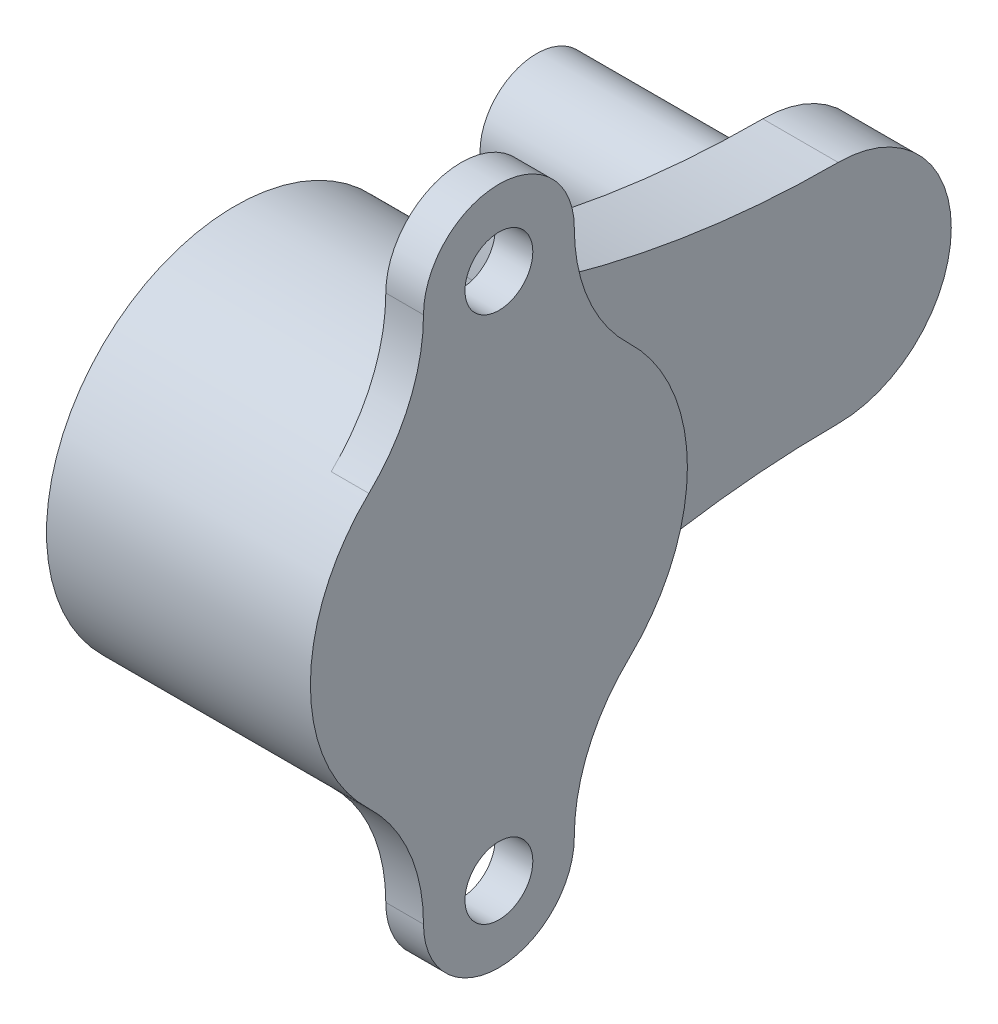
ISO-10303-21;
HEADER;
FILE_DESCRIPTION(('STEP AP214'),'2;1');
FILE_NAME('part.step','',(''),(''),'','','');
FILE_SCHEMA(('AUTOMOTIVE_DESIGN { 1 0 10303 214 1 1 1 1 }'));
ENDSEC;
DATA;
#1=APPLICATION_CONTEXT('core data for automotive mechanical design processes');
#2=APPLICATION_PROTOCOL_DEFINITION('international standard','automotive_design',2000,#1);
#3=PRODUCT_CONTEXT('',#1,'mechanical');
#4=PRODUCT('Part','Part','',(#3));
#5=PRODUCT_RELATED_PRODUCT_CATEGORY('part','',(#4));
#6=PRODUCT_DEFINITION_FORMATION('','',#4);
#7=PRODUCT_DEFINITION_CONTEXT('part definition',#1,'design');
#8=PRODUCT_DEFINITION('design','',#6,#7);
#9=PRODUCT_DEFINITION_SHAPE('','',#8);
#10=(LENGTH_UNIT() NAMED_UNIT(*) SI_UNIT(.MILLI.,.METRE.));
#11=(NAMED_UNIT(*) PLANE_ANGLE_UNIT() SI_UNIT($,.RADIAN.));
#12=(NAMED_UNIT(*) SI_UNIT($,.STERADIAN.) SOLID_ANGLE_UNIT());
#13=UNCERTAINTY_MEASURE_WITH_UNIT(LENGTH_MEASURE(1.E-05),#10,'distance_accuracy_value','');
#14=(GEOMETRIC_REPRESENTATION_CONTEXT(3) GLOBAL_UNCERTAINTY_ASSIGNED_CONTEXT((#13)) GLOBAL_UNIT_ASSIGNED_CONTEXT((#10,
#11,#12)) REPRESENTATION_CONTEXT('',''));
#15=CARTESIAN_POINT('',(0.,0.,0.));
#16=DIRECTION('',(0.,0.,1.));
#17=DIRECTION('',(1.,0.,0.));
#18=AXIS2_PLACEMENT_3D('',#15,#16,#17);
#19=CARTESIAN_POINT('',(0.,0.,0.));
#20=DIRECTION('',(1.,0.,0.));
#21=DIRECTION('',(0.,0.,-1.));
#22=AXIS2_PLACEMENT_3D('',#19,#20,#21);
#23=CYLINDRICAL_SURFACE('',#22,25.);
#24=CARTESIAN_POINT('',(-15.,0.,0.));
#25=DIRECTION('',(1.,0.,0.));
#26=DIRECTION('',(0.,0.,-1.));
#27=AXIS2_PLACEMENT_3D('',#24,#25,#26);
#28=CIRCLE('',#27,25.);
#29=CARTESIAN_POINT('',(-15.,0.,-25.));
#30=VERTEX_POINT('',#29);
#31=EDGE_CURVE('E238',#30,#30,#28,.T.);
#32=ORIENTED_EDGE('',*,*,#31,.T.);
#33=EDGE_LOOP('',(#32));
#34=FACE_BOUND('',#33,.T.);
#35=CARTESIAN_POINT('',(15.,0.,0.));
#36=DIRECTION('',(1.,0.,0.));
#37=DIRECTION('',(0.,0.,-1.));
#38=AXIS2_PLACEMENT_3D('',#35,#36,#37);
#39=CIRCLE('',#38,25.);
#40=CARTESIAN_POINT('',(15.,18.1034482758621,-17.2413793103448));
#41=VERTEX_POINT('',#40);
#42=CARTESIAN_POINT('',(15.,18.1034482758621,17.2413793103448));
#43=VERTEX_POINT('',#42);
#44=EDGE_CURVE('E242',#41,#43,#39,.T.);
#45=ORIENTED_EDGE('',*,*,#44,.F.);
#46=DIRECTION('',(-1.,0.,0.));
#47=VECTOR('',#46,1.);
#48=CARTESIAN_POINT('',(20.,18.1034482758621,-17.2413793103448));
#49=LINE('',#48,#47);
#50=CARTESIAN_POINT('',(20.,18.1034482758621,-17.2413793103448));
#51=VERTEX_POINT('',#50);
#52=EDGE_CURVE('E205',#51,#41,#49,.T.);
#53=ORIENTED_EDGE('',*,*,#52,.F.);
#54=CARTESIAN_POINT('',(20.,0.,0.));
#55=DIRECTION('',(1.,0.,0.));
#56=DIRECTION('',(0.,0.,-1.));
#57=AXIS2_PLACEMENT_3D('',#54,#55,#56);
#58=CIRCLE('',#57,25.);
#59=CARTESIAN_POINT('',(20.,-18.1034482758621,-17.2413793103448));
#60=VERTEX_POINT('',#59);
#61=EDGE_CURVE('E181',#60,#51,#58,.T.);
#62=ORIENTED_EDGE('',*,*,#61,.F.);
#63=DIRECTION('',(-1.,0.,0.));
#64=VECTOR('',#63,1.);
#65=CARTESIAN_POINT('',(20.,-18.1034482758621,-17.2413793103448));
#66=LINE('',#65,#64);
#67=CARTESIAN_POINT('',(15.,-18.1034482758621,-17.2413793103448));
#68=VERTEX_POINT('',#67);
#69=EDGE_CURVE('E208',#60,#68,#66,.T.);
#70=ORIENTED_EDGE('',*,*,#69,.T.);
#71=CARTESIAN_POINT('',(15.,-18.1034482758621,17.2413793103448));
#72=VERTEX_POINT('',#71);
#73=EDGE_CURVE('E241',#72,#68,#39,.T.);
#74=ORIENTED_EDGE('',*,*,#73,.F.);
#75=DIRECTION('',(-1.,0.,0.));
#76=VECTOR('',#75,1.);
#77=CARTESIAN_POINT('',(20.,-18.1034482758621,17.2413793103448));
#78=LINE('',#77,#76);
#79=CARTESIAN_POINT('',(20.,-18.1034482758621,17.2413793103448));
#80=VERTEX_POINT('',#79);
#81=EDGE_CURVE('E217',#80,#72,#78,.T.);
#82=ORIENTED_EDGE('',*,*,#81,.F.);
#83=CARTESIAN_POINT('',(20.,0.,0.));
#84=DIRECTION('',(1.,0.,0.));
#85=DIRECTION('',(0.,0.,-1.));
#86=AXIS2_PLACEMENT_3D('',#83,#84,#85);
#87=CIRCLE('',#86,25.);
#88=CARTESIAN_POINT('',(20.,18.1034482758621,17.2413793103448));
#89=VERTEX_POINT('',#88);
#90=EDGE_CURVE('E172',#89,#80,#87,.T.);
#91=ORIENTED_EDGE('',*,*,#90,.F.);
#92=DIRECTION('',(-1.,0.,0.));
#93=VECTOR('',#92,1.);
#94=CARTESIAN_POINT('',(20.,18.1034482758621,17.2413793103448));
#95=LINE('',#94,#93);
#96=EDGE_CURVE('E220',#89,#43,#95,.T.);
#97=ORIENTED_EDGE('',*,*,#96,.T.);
#98=EDGE_LOOP('',(#45,#53,#62,#70,#74,#82,#91,#97));
#99=FACE_BOUND('',#98,.T.);
#100=DIRECTION('',(-1.,0.,0.));
#101=VECTOR('',#100,1.);
#102=CARTESIAN_POINT('',(10.,-23.4,-8.79999999999999));
#103=LINE('',#102,#101);
#104=CARTESIAN_POINT('',(10.,-23.4,-8.8));
#105=VERTEX_POINT('',#104);
#106=CARTESIAN_POINT('',(0.,-23.4,-8.79999999999998));
#107=VERTEX_POINT('',#106);
#108=EDGE_CURVE('E55',#105,#107,#103,.T.);
#109=ORIENTED_EDGE('',*,*,#108,.F.);
#110=CARTESIAN_POINT('',(10.,0.,0.));
#111=DIRECTION('',(-1.,0.,0.));
#112=DIRECTION('',(0.,0.,1.));
#113=AXIS2_PLACEMENT_3D('',#110,#111,#112);
#114=CIRCLE('',#113,25.);
#115=CARTESIAN_POINT('',(10.,23.4,-8.79999999999999));
#116=VERTEX_POINT('',#115);
#117=EDGE_CURVE('E11',#105,#116,#114,.F.);
#118=ORIENTED_EDGE('',*,*,#117,.T.);
#119=DIRECTION('',(-1.,0.,0.));
#120=VECTOR('',#119,1.);
#121=CARTESIAN_POINT('',(10.,23.4,-8.79999999999999));
#122=LINE('',#121,#120);
#123=CARTESIAN_POINT('',(0.,23.4,-8.79999999999999));
#124=VERTEX_POINT('',#123);
#125=EDGE_CURVE('E154',#116,#124,#122,.T.);
#126=ORIENTED_EDGE('',*,*,#125,.T.);
#127=CARTESIAN_POINT('',(0.,0.,0.));
#128=DIRECTION('',(-1.,0.,0.));
#129=DIRECTION('',(0.,0.,1.));
#130=AXIS2_PLACEMENT_3D('',#127,#128,#129);
#131=CIRCLE('',#130,25.);
#132=EDGE_CURVE('E45',#107,#124,#131,.F.);
#133=ORIENTED_EDGE('',*,*,#132,.F.);
#134=EDGE_LOOP('',(#109,#118,#126,#133));
#135=FACE_BOUND('',#134,.T.);
#136=ADVANCED_FACE('F37',(#34,#99,#135),#23,.T.);
#137=CARTESIAN_POINT('',(-15.,25.,0.));
#138=DIRECTION('',(-1.,0.,0.));
#139=DIRECTION('',(0.,0.,1.));
#140=AXIS2_PLACEMENT_3D('',#137,#138,#139);
#141=PLANE('',#140);
#142=CARTESIAN_POINT('',(-15.,0.,0.));
#143=DIRECTION('',(1.,0.,0.));
#144=DIRECTION('',(0.,0.,-1.));
#145=AXIS2_PLACEMENT_3D('',#142,#143,#144);
#146=CIRCLE('',#145,22.5);
#147=CARTESIAN_POINT('',(-15.,0.,-22.5));
#148=VERTEX_POINT('',#147);
#149=EDGE_CURVE('E235',#148,#148,#146,.T.);
#150=ORIENTED_EDGE('',*,*,#149,.T.);
#151=EDGE_LOOP('',(#150));
#152=FACE_BOUND('',#151,.T.);
#153=ORIENTED_EDGE('',*,*,#31,.F.);
#154=EDGE_LOOP('',(#153));
#155=FACE_BOUND('',#154,.T.);
#156=ADVANCED_FACE('F279',(#152,#155),#141,.T.);
#157=CARTESIAN_POINT('',(0.,0.,0.));
#158=DIRECTION('',(1.,0.,0.));
#159=DIRECTION('',(0.,0.,-1.));
#160=AXIS2_PLACEMENT_3D('',#157,#158,#159);
#161=CYLINDRICAL_SURFACE('',#160,22.5);
#162=CARTESIAN_POINT('',(-12.5,0.,0.));
#163=DIRECTION('',(1.,0.,0.));
#164=DIRECTION('',(0.,0.,-1.));
#165=AXIS2_PLACEMENT_3D('',#162,#163,#164);
#166=CIRCLE('',#165,22.5);
#167=CARTESIAN_POINT('',(-12.5,0.,-22.5));
#168=VERTEX_POINT('',#167);
#169=EDGE_CURVE('E232',#168,#168,#166,.T.);
#170=ORIENTED_EDGE('',*,*,#169,.T.);
#171=EDGE_LOOP('',(#170));
#172=FACE_BOUND('',#171,.T.);
#173=ORIENTED_EDGE('',*,*,#149,.F.);
#174=EDGE_LOOP('',(#173));
#175=FACE_BOUND('',#174,.T.);
#176=ADVANCED_FACE('F284',(#172,#175),#161,.F.);
#177=CARTESIAN_POINT('',(-12.5,7.5,0.));
#178=DIRECTION('',(-1.,0.,0.));
#179=DIRECTION('',(0.,0.,1.));
#180=AXIS2_PLACEMENT_3D('',#177,#178,#179);
#181=PLANE('',#180);
#182=CARTESIAN_POINT('',(-12.5,0.,0.));
#183=DIRECTION('',(1.,0.,0.));
#184=DIRECTION('',(0.,0.,-1.));
#185=AXIS2_PLACEMENT_3D('',#182,#183,#184);
#186=CIRCLE('',#185,7.5);
#187=CARTESIAN_POINT('',(-12.5,0.,-7.5));
#188=VERTEX_POINT('',#187);
#189=EDGE_CURVE('E229',#188,#188,#186,.T.);
#190=ORIENTED_EDGE('',*,*,#189,.T.);
#191=EDGE_LOOP('',(#190));
#192=FACE_BOUND('',#191,.T.);
#193=ORIENTED_EDGE('',*,*,#169,.F.);
#194=EDGE_LOOP('',(#193));
#195=FACE_BOUND('',#194,.T.);
#196=ADVANCED_FACE('F291',(#192,#195),#181,.T.);
#197=CARTESIAN_POINT('',(0.,0.,0.));
#198=DIRECTION('',(1.,0.,0.));
#199=DIRECTION('',(0.,0.,-1.));
#200=AXIS2_PLACEMENT_3D('',#197,#198,#199);
#201=CYLINDRICAL_SURFACE('',#200,7.5);
#202=CARTESIAN_POINT('',(-14.,0.,0.));
#203=DIRECTION('',(-1.,0.,0.));
#204=DIRECTION('',(0.,0.,1.));
#205=AXIS2_PLACEMENT_3D('',#202,#203,#204);
#206=CIRCLE('',#205,7.5);
#207=CARTESIAN_POINT('',(-14.,0.,7.5));
#208=VERTEX_POINT('',#207);
#209=EDGE_CURVE('E244',#208,#208,#206,.F.);
#210=ORIENTED_EDGE('',*,*,#209,.T.);
#211=EDGE_LOOP('',(#210));
#212=FACE_BOUND('',#211,.T.);
#213=ORIENTED_EDGE('',*,*,#189,.F.);
#214=EDGE_LOOP('',(#213));
#215=FACE_BOUND('',#214,.T.);
#216=ADVANCED_FACE('F295',(#212,#215),#201,.T.);
#217=CARTESIAN_POINT('',(-15.,7.5,0.));
#218=DIRECTION('',(-1.,0.,0.));
#219=DIRECTION('',(0.,0.,1.));
#220=AXIS2_PLACEMENT_3D('',#217,#218,#219);
#221=PLANE('',#220);
#222=CARTESIAN_POINT('',(-15.,0.,0.));
#223=DIRECTION('',(-1.,0.,0.));
#224=DIRECTION('',(0.,0.,1.));
#225=AXIS2_PLACEMENT_3D('',#222,#223,#224);
#226=CIRCLE('',#225,6.5);
#227=CARTESIAN_POINT('',(-15.,0.,6.5));
#228=VERTEX_POINT('',#227);
#229=EDGE_CURVE('E247',#228,#228,#226,.T.);
#230=ORIENTED_EDGE('',*,*,#229,.T.);
#231=EDGE_LOOP('',(#230));
#232=FACE_BOUND('',#231,.T.);
#233=CARTESIAN_POINT('',(-15.,0.,0.));
#234=DIRECTION('',(1.,0.,0.));
#235=DIRECTION('',(0.,0.,-1.));
#236=AXIS2_PLACEMENT_3D('',#233,#234,#235);
#237=CIRCLE('',#236,5.);
#238=CARTESIAN_POINT('',(-15.,0.,-5.));
#239=VERTEX_POINT('',#238);
#240=EDGE_CURVE('E226',#239,#239,#237,.T.);
#241=ORIENTED_EDGE('',*,*,#240,.T.);
#242=EDGE_LOOP('',(#241));
#243=FACE_BOUND('',#242,.T.);
#244=ADVANCED_FACE('F299',(#232,#243),#221,.T.);
#245=CARTESIAN_POINT('',(0.,0.,0.));
#246=DIRECTION('',(1.,0.,0.));
#247=DIRECTION('',(0.,0.,-1.));
#248=AXIS2_PLACEMENT_3D('',#245,#246,#247);
#249=CYLINDRICAL_SURFACE('',#248,5.);
#250=CARTESIAN_POINT('',(15.,0.,0.));
#251=DIRECTION('',(1.,0.,0.));
#252=DIRECTION('',(0.,0.,-1.));
#253=AXIS2_PLACEMENT_3D('',#250,#251,#252);
#254=CIRCLE('',#253,5.);
#255=CARTESIAN_POINT('',(15.,0.,-5.));
#256=VERTEX_POINT('',#255);
#257=EDGE_CURVE('E223',#256,#256,#254,.T.);
#258=ORIENTED_EDGE('',*,*,#257,.T.);
#259=EDGE_LOOP('',(#258));
#260=FACE_BOUND('',#259,.T.);
#261=ORIENTED_EDGE('',*,*,#240,.F.);
#262=EDGE_LOOP('',(#261));
#263=FACE_BOUND('',#262,.T.);
#264=ADVANCED_FACE('F303',(#260,#263),#249,.F.);
#265=CARTESIAN_POINT('',(-14.,0.,0.));
#266=DIRECTION('',(-1.,0.,0.));
#267=DIRECTION('',(0.,0.,1.));
#268=AXIS2_PLACEMENT_3D('',#265,#266,#267);
#269=TOROIDAL_SURFACE('',#268,6.5,1.);
#270=ORIENTED_EDGE('',*,*,#229,.F.);
#271=EDGE_LOOP('',(#270));
#272=FACE_BOUND('',#271,.T.);
#273=ORIENTED_EDGE('',*,*,#209,.F.);
#274=EDGE_LOOP('',(#273));
#275=FACE_BOUND('',#274,.T.);
#276=ADVANCED_FACE('F39',(#272,#275),#269,.T.);
#277=CARTESIAN_POINT('',(15.,17.5,16.6666666666667));
#278=DIRECTION('',(-1.,0.,0.));
#279=DIRECTION('',(0.,0.,1.));
#280=AXIS2_PLACEMENT_3D('',#277,#278,#279);
#281=PLANE('',#280);
#282=ORIENTED_EDGE('',*,*,#257,.F.);
#283=EDGE_LOOP('',(#282));
#284=FACE_BOUND('',#283,.T.);
#285=ADVANCED_FACE('F334',(#284),#281,.T.);
#286=CARTESIAN_POINT('',(15.,35.,0.));
#287=DIRECTION('',(1.,0.,0.));
#288=DIRECTION('',(0.,0.,-1.));
#289=AXIS2_PLACEMENT_3D('',#286,#287,#288);
#290=CIRCLE('',#289,4.5);
#291=CARTESIAN_POINT('',(15.,35.,-4.5));
#292=VERTEX_POINT('',#291);
#293=EDGE_CURVE('E156',#292,#292,#290,.T.);
#294=ORIENTED_EDGE('',*,*,#293,.T.);
#295=EDGE_LOOP('',(#294));
#296=FACE_BOUND('',#295,.T.);
#297=CARTESIAN_POINT('',(15.,35.,-33.3333333333333));
#298=DIRECTION('',(-1.,0.,0.));
#299=DIRECTION('',(0.,0.,-1.));
#300=AXIS2_PLACEMENT_3D('',#297,#298,#299);
#301=CIRCLE('',#300,23.3333333333333);
#302=CARTESIAN_POINT('',(15.,35.,-10.));
#303=VERTEX_POINT('',#302);
#304=EDGE_CURVE('E197',#41,#303,#301,.T.);
#305=ORIENTED_EDGE('',*,*,#304,.F.);
#306=ORIENTED_EDGE('',*,*,#44,.T.);
#307=CARTESIAN_POINT('',(15.,35.,33.3333333333333));
#308=DIRECTION('',(-1.,0.,0.));
#309=DIRECTION('',(0.,0.,1.));
#310=AXIS2_PLACEMENT_3D('',#307,#308,#309);
#311=CIRCLE('',#310,23.3333333333333);
#312=CARTESIAN_POINT('',(15.,35.,10.));
#313=VERTEX_POINT('',#312);
#314=EDGE_CURVE('E166',#313,#43,#311,.T.);
#315=ORIENTED_EDGE('',*,*,#314,.F.);
#316=CARTESIAN_POINT('',(15.,35.,0.));
#317=DIRECTION('',(1.,0.,0.));
#318=DIRECTION('',(0.,0.,-1.));
#319=AXIS2_PLACEMENT_3D('',#316,#317,#318);
#320=CIRCLE('',#319,10.);
#321=EDGE_CURVE('E173',#303,#313,#320,.T.);
#322=ORIENTED_EDGE('',*,*,#321,.F.);
#323=EDGE_LOOP('',(#305,#306,#315,#322));
#324=FACE_BOUND('',#323,.T.);
#325=ADVANCED_FACE('F337',(#296,#324),#281,.T.);
#326=CARTESIAN_POINT('',(15.,-35.,0.));
#327=DIRECTION('',(1.,0.,0.));
#328=DIRECTION('',(0.,0.,-1.));
#329=AXIS2_PLACEMENT_3D('',#326,#327,#328);
#330=CIRCLE('',#329,4.5);
#331=CARTESIAN_POINT('',(15.,-35.,-4.5));
#332=VERTEX_POINT('',#331);
#333=EDGE_CURVE('E160',#332,#332,#330,.T.);
#334=ORIENTED_EDGE('',*,*,#333,.T.);
#335=EDGE_LOOP('',(#334));
#336=FACE_BOUND('',#335,.T.);
#337=CARTESIAN_POINT('',(15.,-35.,33.3333333333334));
#338=DIRECTION('',(-1.,0.,0.));
#339=DIRECTION('',(0.,0.,-1.));
#340=AXIS2_PLACEMENT_3D('',#337,#338,#339);
#341=CIRCLE('',#340,23.3333333333334);
#342=CARTESIAN_POINT('',(15.,-35.,10.));
#343=VERTEX_POINT('',#342);
#344=EDGE_CURVE('E190',#72,#343,#341,.T.);
#345=ORIENTED_EDGE('',*,*,#344,.F.);
#346=ORIENTED_EDGE('',*,*,#73,.T.);
#347=CARTESIAN_POINT('',(15.,-35.,-33.3333333333334));
#348=DIRECTION('',(-1.,0.,0.));
#349=DIRECTION('',(0.,0.,1.));
#350=AXIS2_PLACEMENT_3D('',#347,#348,#349);
#351=CIRCLE('',#350,23.3333333333334);
#352=CARTESIAN_POINT('',(15.,-35.,-10.));
#353=VERTEX_POINT('',#352);
#354=EDGE_CURVE('E194',#353,#68,#351,.T.);
#355=ORIENTED_EDGE('',*,*,#354,.F.);
#356=CARTESIAN_POINT('',(15.,-35.,0.));
#357=DIRECTION('',(1.,0.,0.));
#358=DIRECTION('',(0.,0.,-1.));
#359=AXIS2_PLACEMENT_3D('',#356,#357,#358);
#360=CIRCLE('',#359,10.);
#361=EDGE_CURVE('E192',#343,#353,#360,.T.);
#362=ORIENTED_EDGE('',*,*,#361,.F.);
#363=EDGE_LOOP('',(#345,#346,#355,#362));
#364=FACE_BOUND('',#363,.T.);
#365=ADVANCED_FACE('F339',(#336,#364),#281,.T.);
#366=CARTESIAN_POINT('',(20.,17.5,16.6666666666667));
#367=DIRECTION('',(-1.,0.,0.));
#368=DIRECTION('',(0.,0.,1.));
#369=AXIS2_PLACEMENT_3D('',#366,#367,#368);
#370=PLANE('',#369);
#371=CARTESIAN_POINT('',(20.,35.,33.3333333333333));
#372=DIRECTION('',(-1.,0.,0.));
#373=DIRECTION('',(0.,0.,1.));
#374=AXIS2_PLACEMENT_3D('',#371,#372,#373);
#375=CIRCLE('',#374,23.3333333333333);
#376=CARTESIAN_POINT('',(20.,35.,10.));
#377=VERTEX_POINT('',#376);
#378=EDGE_CURVE('E169',#377,#89,#375,.T.);
#379=ORIENTED_EDGE('',*,*,#378,.T.);
#380=ORIENTED_EDGE('',*,*,#90,.T.);
#381=CARTESIAN_POINT('',(20.,-35.,33.3333333333334));
#382=DIRECTION('',(-1.,0.,0.));
#383=DIRECTION('',(0.,0.,-1.));
#384=AXIS2_PLACEMENT_3D('',#381,#382,#383);
#385=CIRCLE('',#384,23.3333333333334);
#386=CARTESIAN_POINT('',(20.,-35.,10.));
#387=VERTEX_POINT('',#386);
#388=EDGE_CURVE('E175',#80,#387,#385,.T.);
#389=ORIENTED_EDGE('',*,*,#388,.T.);
#390=CARTESIAN_POINT('',(20.,-35.,0.));
#391=DIRECTION('',(1.,0.,0.));
#392=DIRECTION('',(0.,0.,-1.));
#393=AXIS2_PLACEMENT_3D('',#390,#391,#392);
#394=CIRCLE('',#393,10.);
#395=CARTESIAN_POINT('',(20.,-35.,-10.));
#396=VERTEX_POINT('',#395);
#397=EDGE_CURVE('E177',#387,#396,#394,.T.);
#398=ORIENTED_EDGE('',*,*,#397,.T.);
#399=CARTESIAN_POINT('',(20.,-35.,-33.3333333333334));
#400=DIRECTION('',(-1.,0.,0.));
#401=DIRECTION('',(0.,0.,1.));
#402=AXIS2_PLACEMENT_3D('',#399,#400,#401);
#403=CIRCLE('',#402,23.3333333333334);
#404=EDGE_CURVE('E179',#396,#60,#403,.T.);
#405=ORIENTED_EDGE('',*,*,#404,.T.);
#406=ORIENTED_EDGE('',*,*,#61,.T.);
#407=CARTESIAN_POINT('',(20.,35.,-33.3333333333333));
#408=DIRECTION('',(-1.,0.,0.));
#409=DIRECTION('',(0.,0.,-1.));
#410=AXIS2_PLACEMENT_3D('',#407,#408,#409);
#411=CIRCLE('',#410,23.3333333333333);
#412=CARTESIAN_POINT('',(20.,35.,-10.));
#413=VERTEX_POINT('',#412);
#414=EDGE_CURVE('E183',#51,#413,#411,.T.);
#415=ORIENTED_EDGE('',*,*,#414,.T.);
#416=CARTESIAN_POINT('',(20.,35.,0.));
#417=DIRECTION('',(1.,0.,0.));
#418=DIRECTION('',(0.,0.,-1.));
#419=AXIS2_PLACEMENT_3D('',#416,#417,#418);
#420=CIRCLE('',#419,10.);
#421=EDGE_CURVE('E185',#413,#377,#420,.T.);
#422=ORIENTED_EDGE('',*,*,#421,.T.);
#423=EDGE_LOOP('',(#379,#380,#389,#398,#405,#406,#415,#422));
#424=FACE_BOUND('',#423,.T.);
#425=CARTESIAN_POINT('',(20.,-35.,0.));
#426=DIRECTION('',(1.,0.,0.));
#427=DIRECTION('',(0.,0.,-1.));
#428=AXIS2_PLACEMENT_3D('',#425,#426,#427);
#429=CIRCLE('',#428,4.5);
#430=CARTESIAN_POINT('',(20.,-35.,-4.5));
#431=VERTEX_POINT('',#430);
#432=EDGE_CURVE('E163',#431,#431,#429,.T.);
#433=ORIENTED_EDGE('',*,*,#432,.F.);
#434=EDGE_LOOP('',(#433));
#435=FACE_BOUND('',#434,.T.);
#436=CARTESIAN_POINT('',(20.,35.,0.));
#437=DIRECTION('',(1.,0.,0.));
#438=DIRECTION('',(0.,0.,-1.));
#439=AXIS2_PLACEMENT_3D('',#436,#437,#438);
#440=CIRCLE('',#439,4.5);
#441=CARTESIAN_POINT('',(20.,35.,-4.5));
#442=VERTEX_POINT('',#441);
#443=EDGE_CURVE('E157',#442,#442,#440,.T.);
#444=ORIENTED_EDGE('',*,*,#443,.F.);
#445=EDGE_LOOP('',(#444));
#446=FACE_BOUND('',#445,.T.);
#447=ADVANCED_FACE('F312',(#424,#435,#446),#370,.F.);
#448=CARTESIAN_POINT('',(20.,35.,33.3333333333333));
#449=DIRECTION('',(-1.,0.,0.));
#450=DIRECTION('',(0.,0.,1.));
#451=AXIS2_PLACEMENT_3D('',#448,#449,#450);
#452=CYLINDRICAL_SURFACE('',#451,23.3333333333333);
#453=ORIENTED_EDGE('',*,*,#314,.T.);
#454=ORIENTED_EDGE('',*,*,#96,.F.);
#455=ORIENTED_EDGE('',*,*,#378,.F.);
#456=DIRECTION('',(-1.,0.,0.));
#457=VECTOR('',#456,1.);
#458=CARTESIAN_POINT('',(20.,35.,10.));
#459=LINE('',#458,#457);
#460=EDGE_CURVE('E187',#377,#313,#459,.T.);
#461=ORIENTED_EDGE('',*,*,#460,.T.);
#462=EDGE_LOOP('',(#453,#454,#455,#461));
#463=FACE_BOUND('',#462,.T.);
#464=ADVANCED_FACE('F308',(#463),#452,.F.);
#465=CARTESIAN_POINT('',(20.,-35.,33.3333333333334));
#466=DIRECTION('',(-1.,0.,0.));
#467=DIRECTION('',(0.,0.,1.));
#468=AXIS2_PLACEMENT_3D('',#465,#466,#467);
#469=CYLINDRICAL_SURFACE('',#468,23.3333333333334);
#470=ORIENTED_EDGE('',*,*,#344,.T.);
#471=DIRECTION('',(-1.,0.,0.));
#472=VECTOR('',#471,1.);
#473=CARTESIAN_POINT('',(20.,-35.,10.));
#474=LINE('',#473,#472);
#475=EDGE_CURVE('E214',#387,#343,#474,.T.);
#476=ORIENTED_EDGE('',*,*,#475,.F.);
#477=ORIENTED_EDGE('',*,*,#388,.F.);
#478=ORIENTED_EDGE('',*,*,#81,.T.);
#479=EDGE_LOOP('',(#470,#476,#477,#478));
#480=FACE_BOUND('',#479,.T.);
#481=ADVANCED_FACE('F311',(#480),#469,.F.);
#482=CARTESIAN_POINT('',(20.,-35.,0.));
#483=DIRECTION('',(-1.,0.,0.));
#484=DIRECTION('',(0.,0.,1.));
#485=AXIS2_PLACEMENT_3D('',#482,#483,#484);
#486=CYLINDRICAL_SURFACE('',#485,10.);
#487=ORIENTED_EDGE('',*,*,#361,.T.);
#488=DIRECTION('',(-1.,0.,0.));
#489=VECTOR('',#488,1.);
#490=CARTESIAN_POINT('',(20.,-35.,-10.));
#491=LINE('',#490,#489);
#492=EDGE_CURVE('E211',#396,#353,#491,.T.);
#493=ORIENTED_EDGE('',*,*,#492,.F.);
#494=ORIENTED_EDGE('',*,*,#397,.F.);
#495=ORIENTED_EDGE('',*,*,#475,.T.);
#496=EDGE_LOOP('',(#487,#493,#494,#495));
#497=FACE_BOUND('',#496,.T.);
#498=ADVANCED_FACE('F316',(#497),#486,.T.);
#499=CARTESIAN_POINT('',(20.,-35.,-33.3333333333334));
#500=DIRECTION('',(-1.,0.,0.));
#501=DIRECTION('',(0.,0.,1.));
#502=AXIS2_PLACEMENT_3D('',#499,#500,#501);
#503=CYLINDRICAL_SURFACE('',#502,23.3333333333334);
#504=ORIENTED_EDGE('',*,*,#354,.T.);
#505=ORIENTED_EDGE('',*,*,#69,.F.);
#506=ORIENTED_EDGE('',*,*,#404,.F.);
#507=ORIENTED_EDGE('',*,*,#492,.T.);
#508=EDGE_LOOP('',(#504,#505,#506,#507));
#509=FACE_BOUND('',#508,.T.);
#510=ADVANCED_FACE('F320',(#509),#503,.F.);
#511=CARTESIAN_POINT('',(20.,35.,-33.3333333333333));
#512=DIRECTION('',(-1.,0.,0.));
#513=DIRECTION('',(0.,0.,1.));
#514=AXIS2_PLACEMENT_3D('',#511,#512,#513);
#515=CYLINDRICAL_SURFACE('',#514,23.3333333333333);
#516=ORIENTED_EDGE('',*,*,#304,.T.);
#517=DIRECTION('',(-1.,0.,0.));
#518=VECTOR('',#517,1.);
#519=CARTESIAN_POINT('',(20.,35.,-10.));
#520=LINE('',#519,#518);
#521=EDGE_CURVE('E202',#413,#303,#520,.T.);
#522=ORIENTED_EDGE('',*,*,#521,.F.);
#523=ORIENTED_EDGE('',*,*,#414,.F.);
#524=ORIENTED_EDGE('',*,*,#52,.T.);
#525=EDGE_LOOP('',(#516,#522,#523,#524));
#526=FACE_BOUND('',#525,.T.);
#527=ADVANCED_FACE('F324',(#526),#515,.F.);
#528=CARTESIAN_POINT('',(20.,35.,0.));
#529=DIRECTION('',(-1.,0.,0.));
#530=DIRECTION('',(0.,0.,1.));
#531=AXIS2_PLACEMENT_3D('',#528,#529,#530);
#532=CYLINDRICAL_SURFACE('',#531,10.);
#533=ORIENTED_EDGE('',*,*,#321,.T.);
#534=ORIENTED_EDGE('',*,*,#460,.F.);
#535=ORIENTED_EDGE('',*,*,#421,.F.);
#536=ORIENTED_EDGE('',*,*,#521,.T.);
#537=EDGE_LOOP('',(#533,#534,#535,#536));
#538=FACE_BOUND('',#537,.T.);
#539=ADVANCED_FACE('F328',(#538),#532,.T.);
#540=CARTESIAN_POINT('',(20.,-35.,0.));
#541=DIRECTION('',(-1.,0.,0.));
#542=DIRECTION('',(0.,0.,1.));
#543=AXIS2_PLACEMENT_3D('',#540,#541,#542);
#544=CYLINDRICAL_SURFACE('',#543,4.5);
#545=ORIENTED_EDGE('',*,*,#432,.T.);
#546=EDGE_LOOP('',(#545));
#547=FACE_BOUND('',#546,.T.);
#548=ORIENTED_EDGE('',*,*,#333,.F.);
#549=EDGE_LOOP('',(#548));
#550=FACE_BOUND('',#549,.T.);
#551=ADVANCED_FACE('F332',(#547,#550),#544,.F.);
#552=CARTESIAN_POINT('',(20.,35.,0.));
#553=DIRECTION('',(-1.,0.,0.));
#554=DIRECTION('',(0.,0.,1.));
#555=AXIS2_PLACEMENT_3D('',#552,#553,#554);
#556=CYLINDRICAL_SURFACE('',#555,4.5);
#557=ORIENTED_EDGE('',*,*,#443,.T.);
#558=EDGE_LOOP('',(#557));
#559=FACE_BOUND('',#558,.T.);
#560=ORIENTED_EDGE('',*,*,#293,.F.);
#561=EDGE_LOOP('',(#560));
#562=FACE_BOUND('',#561,.T.);
#563=ADVANCED_FACE('F345',(#559,#562),#556,.F.);
#564=CARTESIAN_POINT('',(10.,146.25,-55.));
#565=DIRECTION('',(-1.,0.,0.));
#566=DIRECTION('',(0.,0.,1.));
#567=AXIS2_PLACEMENT_3D('',#564,#565,#566);
#568=CYLINDRICAL_SURFACE('',#567,131.25);
#569=CARTESIAN_POINT('',(0.,146.25,-55.));
#570=DIRECTION('',(-1.,0.,0.));
#571=DIRECTION('',(0.,0.,1.));
#572=AXIS2_PLACEMENT_3D('',#569,#570,#571);
#573=CIRCLE('',#572,131.25);
#574=CARTESIAN_POINT('',(0.,15.,-55.));
#575=VERTEX_POINT('',#574);
#576=EDGE_CURVE('E146',#575,#124,#573,.T.);
#577=ORIENTED_EDGE('',*,*,#576,.T.);
#578=ORIENTED_EDGE('',*,*,#125,.F.);
#579=CARTESIAN_POINT('',(10.,146.25,-55.));
#580=DIRECTION('',(-1.,0.,0.));
#581=DIRECTION('',(0.,0.,1.));
#582=AXIS2_PLACEMENT_3D('',#579,#580,#581);
#583=CIRCLE('',#582,131.25);
#584=CARTESIAN_POINT('',(10.,15.,-55.));
#585=VERTEX_POINT('',#584);
#586=EDGE_CURVE('E128',#585,#116,#583,.T.);
#587=ORIENTED_EDGE('',*,*,#586,.F.);
#588=DIRECTION('',(-1.,0.,0.));
#589=VECTOR('',#588,1.);
#590=CARTESIAN_POINT('',(10.,15.,-55.));
#591=LINE('',#590,#589);
#592=EDGE_CURVE('E137',#585,#575,#591,.T.);
#593=ORIENTED_EDGE('',*,*,#592,.T.);
#594=EDGE_LOOP('',(#577,#578,#587,#593));
#595=FACE_BOUND('',#594,.T.);
#596=ADVANCED_FACE('F255',(#595),#568,.F.);
#597=CARTESIAN_POINT('',(10.,-146.25,-55.));
#598=DIRECTION('',(-1.,0.,0.));
#599=DIRECTION('',(0.,0.,1.));
#600=AXIS2_PLACEMENT_3D('',#597,#598,#599);
#601=CYLINDRICAL_SURFACE('',#600,131.25);
#602=CARTESIAN_POINT('',(0.,-146.25,-55.));
#603=DIRECTION('',(-1.,0.,0.));
#604=DIRECTION('',(0.,0.,-1.));
#605=AXIS2_PLACEMENT_3D('',#602,#603,#604);
#606=CIRCLE('',#605,131.25);
#607=CARTESIAN_POINT('',(0.,-15.,-55.));
#608=VERTEX_POINT('',#607);
#609=EDGE_CURVE('E134',#107,#608,#606,.T.);
#610=ORIENTED_EDGE('',*,*,#609,.T.);
#611=DIRECTION('',(-1.,0.,0.));
#612=VECTOR('',#611,1.);
#613=CARTESIAN_POINT('',(10.,-15.,-55.));
#614=LINE('',#613,#612);
#615=CARTESIAN_POINT('',(10.,-15.,-55.));
#616=VERTEX_POINT('',#615);
#617=EDGE_CURVE('E131',#616,#608,#614,.T.);
#618=ORIENTED_EDGE('',*,*,#617,.F.);
#619=CARTESIAN_POINT('',(10.,-146.25,-55.));
#620=DIRECTION('',(-1.,0.,0.));
#621=DIRECTION('',(0.,0.,-1.));
#622=AXIS2_PLACEMENT_3D('',#619,#620,#621);
#623=CIRCLE('',#622,131.25);
#624=EDGE_CURVE('E121',#105,#616,#623,.T.);
#625=ORIENTED_EDGE('',*,*,#624,.F.);
#626=ORIENTED_EDGE('',*,*,#108,.T.);
#627=EDGE_LOOP('',(#610,#618,#625,#626));
#628=FACE_BOUND('',#627,.T.);
#629=ADVANCED_FACE('F132',(#628),#601,.F.);
#630=CARTESIAN_POINT('',(10.,0.,-55.));
#631=DIRECTION('',(-1.,0.,0.));
#632=DIRECTION('',(0.,0.,1.));
#633=AXIS2_PLACEMENT_3D('',#630,#631,#632);
#634=CYLINDRICAL_SURFACE('',#633,15.);
#635=CARTESIAN_POINT('',(0.,0.,-55.));
#636=DIRECTION('',(1.,0.,0.));
#637=DIRECTION('',(0.,0.,-1.));
#638=AXIS2_PLACEMENT_3D('',#635,#636,#637);
#639=CIRCLE('',#638,15.);
#640=EDGE_CURVE('E151',#608,#575,#639,.T.);
#641=ORIENTED_EDGE('',*,*,#640,.T.);
#642=ORIENTED_EDGE('',*,*,#592,.F.);
#643=CARTESIAN_POINT('',(10.,0.,-55.));
#644=DIRECTION('',(1.,0.,0.));
#645=DIRECTION('',(0.,0.,-1.));
#646=AXIS2_PLACEMENT_3D('',#643,#644,#645);
#647=CIRCLE('',#646,15.);
#648=EDGE_CURVE('E125',#616,#585,#647,.T.);
#649=ORIENTED_EDGE('',*,*,#648,.F.);
#650=ORIENTED_EDGE('',*,*,#617,.T.);
#651=EDGE_LOOP('',(#641,#642,#649,#650));
#652=FACE_BOUND('',#651,.T.);
#653=ADVANCED_FACE('F139',(#652),#634,.T.);
#654=CARTESIAN_POINT('',(10.,146.25,-55.));
#655=DIRECTION('',(-1.,0.,0.));
#656=DIRECTION('',(0.,0.,1.));
#657=AXIS2_PLACEMENT_3D('',#654,#655,#656);
#658=PLANE('',#657);
#659=ORIENTED_EDGE('',*,*,#117,.F.);
#660=ORIENTED_EDGE('',*,*,#624,.T.);
#661=ORIENTED_EDGE('',*,*,#648,.T.);
#662=ORIENTED_EDGE('',*,*,#586,.T.);
#663=EDGE_LOOP('',(#659,#660,#661,#662));
#664=FACE_BOUND('',#663,.T.);
#665=ADVANCED_FACE('F123',(#664),#658,.F.);
#666=CARTESIAN_POINT('',(0.,146.25,-55.));
#667=DIRECTION('',(-1.,0.,0.));
#668=DIRECTION('',(0.,0.,1.));
#669=AXIS2_PLACEMENT_3D('',#666,#667,#668);
#670=PLANE('',#669);
#671=CARTESIAN_POINT('',(0.,0.,-55.));
#672=DIRECTION('',(-1.,0.,0.));
#673=DIRECTION('',(0.,0.,1.));
#674=AXIS2_PLACEMENT_3D('',#671,#672,#673);
#675=CIRCLE('',#674,7.50000000000001);
#676=CARTESIAN_POINT('',(0.,0.,-47.5));
#677=VERTEX_POINT('',#676);
#678=EDGE_CURVE('E257',#677,#677,#675,.T.);
#679=ORIENTED_EDGE('',*,*,#678,.F.);
#680=EDGE_LOOP('',(#679));
#681=FACE_BOUND('',#680,.T.);
#682=ORIENTED_EDGE('',*,*,#609,.F.);
#683=ORIENTED_EDGE('',*,*,#132,.T.);
#684=ORIENTED_EDGE('',*,*,#576,.F.);
#685=ORIENTED_EDGE('',*,*,#640,.F.);
#686=EDGE_LOOP('',(#682,#683,#684,#685));
#687=FACE_BOUND('',#686,.T.);
#688=ADVANCED_FACE('F252',(#681,#687),#670,.T.);
#689=CARTESIAN_POINT('',(-30.,0.,-55.));
#690=DIRECTION('',(1.,0.,0.));
#691=DIRECTION('',(0.,0.,-1.));
#692=AXIS2_PLACEMENT_3D('',#689,#690,#691);
#693=CYLINDRICAL_SURFACE('',#692,7.50000000000001);
#694=CARTESIAN_POINT('',(-30.,0.,-55.));
#695=DIRECTION('',(-1.,0.,0.));
#696=DIRECTION('',(0.,0.,1.));
#697=AXIS2_PLACEMENT_3D('',#694,#695,#696);
#698=CIRCLE('',#697,7.50000000000001);
#699=CARTESIAN_POINT('',(-30.,0.,-47.5));
#700=VERTEX_POINT('',#699);
#701=EDGE_CURVE('E149',#700,#700,#698,.T.);
#702=ORIENTED_EDGE('',*,*,#701,.F.);
#703=EDGE_LOOP('',(#702));
#704=FACE_BOUND('',#703,.T.);
#705=ORIENTED_EDGE('',*,*,#678,.T.);
#706=EDGE_LOOP('',(#705));
#707=FACE_BOUND('',#706,.T.);
#708=ADVANCED_FACE('F265',(#704,#707),#693,.T.);
#709=CARTESIAN_POINT('',(-30.,0.,-55.));
#710=DIRECTION('',(-1.,0.,0.));
#711=DIRECTION('',(0.,0.,1.));
#712=AXIS2_PLACEMENT_3D('',#709,#710,#711);
#713=PLANE('',#712);
#714=ORIENTED_EDGE('',*,*,#701,.T.);
#715=EDGE_LOOP('',(#714));
#716=FACE_BOUND('',#715,.T.);
#717=ADVANCED_FACE('F263',(#716),#713,.T.);
#718=CLOSED_SHELL('',(#136,#156,#176,#196,#216,#244,#264,#276,#285,#325,#365,#447,#464,#481,
#498,#510,#527,#539,#551,#563,#596,#629,#653,#665,#688,#708,#717));
#719=MANIFOLD_SOLID_BREP('B2',#718);
#720=ADVANCED_BREP_SHAPE_REPRESENTATION('',(#18,#719),#14);
#721=SHAPE_DEFINITION_REPRESENTATION(#9,#720);
ENDSEC;
END-ISO-10303-21;
